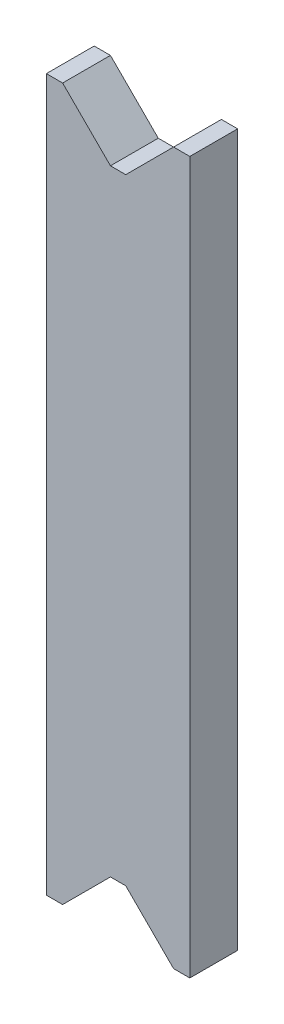
ISO-10303-21;
HEADER;
FILE_DESCRIPTION(('STEP AP214'),'2;1');
FILE_NAME('part.step','',(''),(''),'','','');
FILE_SCHEMA(('AUTOMOTIVE_DESIGN { 1 0 10303 214 1 1 1 1 }'));
ENDSEC;
DATA;
#1=APPLICATION_CONTEXT('core data for automotive mechanical design processes');
#2=APPLICATION_PROTOCOL_DEFINITION('international standard','automotive_design',2000,#1);
#3=PRODUCT_CONTEXT('',#1,'mechanical');
#4=PRODUCT('Part','Part','',(#3));
#5=PRODUCT_RELATED_PRODUCT_CATEGORY('part','',(#4));
#6=PRODUCT_DEFINITION_FORMATION('','',#4);
#7=PRODUCT_DEFINITION_CONTEXT('part definition',#1,'design');
#8=PRODUCT_DEFINITION('design','',#6,#7);
#9=PRODUCT_DEFINITION_SHAPE('','',#8);
#10=(LENGTH_UNIT() NAMED_UNIT(*) SI_UNIT(.MILLI.,.METRE.));
#11=(NAMED_UNIT(*) PLANE_ANGLE_UNIT() SI_UNIT($,.RADIAN.));
#12=(NAMED_UNIT(*) SI_UNIT($,.STERADIAN.) SOLID_ANGLE_UNIT());
#13=UNCERTAINTY_MEASURE_WITH_UNIT(LENGTH_MEASURE(1.E-05),#10,'distance_accuracy_value','');
#14=(GEOMETRIC_REPRESENTATION_CONTEXT(3) GLOBAL_UNCERTAINTY_ASSIGNED_CONTEXT((#13)) GLOBAL_UNIT_ASSIGNED_CONTEXT((#10,
#11,#12)) REPRESENTATION_CONTEXT('',''));
#15=CARTESIAN_POINT('',(0.,0.,0.));
#16=DIRECTION('',(0.,0.,1.));
#17=DIRECTION('',(1.,0.,0.));
#18=AXIS2_PLACEMENT_3D('',#15,#16,#17);
#19=CARTESIAN_POINT('',(-105.726517228664,-444.227073158468,-1458.14397018632));
#20=DIRECTION('',(0.,-1.,0.));
#21=DIRECTION('',(1.,0.,0.));
#22=AXIS2_PLACEMENT_3D('',#19,#20,#21);
#23=PLANE('',#22);
#24=DIRECTION('',(0.,0.,1.));
#25=VECTOR('',#24,1.);
#26=CARTESIAN_POINT('',(-104.647017228664,-444.227073158468,-1458.14397018632));
#27=LINE('',#26,#25);
#28=CARTESIAN_POINT('',(-104.647017228664,-444.227073158468,-1454.96897018632));
#29=VERTEX_POINT('',#28);
#30=CARTESIAN_POINT('',(-104.647017228664,-444.227073158468,-1458.14397018632));
#31=VERTEX_POINT('',#30);
#32=EDGE_CURVE('E154',#29,#31,#27,.F.);
#33=ORIENTED_EDGE('',*,*,#32,.F.);
#34=DIRECTION('',(1.,0.,0.));
#35=VECTOR('',#34,1.);
#36=CARTESIAN_POINT('',(-105.726517228664,-444.227073158468,-1454.96897018632));
#37=LINE('',#36,#35);
#38=CARTESIAN_POINT('',(-105.726517228664,-444.227073158468,-1454.96897018632));
#39=VERTEX_POINT('',#38);
#40=EDGE_CURVE('E20',#29,#39,#37,.F.);
#41=ORIENTED_EDGE('',*,*,#40,.T.);
#42=DIRECTION('',(0.,0.,1.));
#43=VECTOR('',#42,1.);
#44=CARTESIAN_POINT('',(-105.726517228664,-444.227073158468,-1458.14397018632));
#45=LINE('',#44,#43);
#46=CARTESIAN_POINT('',(-105.726517228664,-444.227073158468,-1458.14397018632));
#47=VERTEX_POINT('',#46);
#48=EDGE_CURVE('E125',#47,#39,#45,.T.);
#49=ORIENTED_EDGE('',*,*,#48,.F.);
#50=DIRECTION('',(1.,0.,0.));
#51=VECTOR('',#50,1.);
#52=CARTESIAN_POINT('',(-109.409517228664,-444.227073158468,-1458.14397018632));
#53=LINE('',#52,#51);
#54=EDGE_CURVE('E102',#47,#31,#53,.T.);
#55=ORIENTED_EDGE('',*,*,#54,.T.);
#56=EDGE_LOOP('',(#33,#41,#49,#55));
#57=FACE_BOUND('',#56,.T.);
#58=ADVANCED_FACE('F17',(#57),#23,.T.);
#59=CARTESIAN_POINT('',(-104.647017228664,-396.983073158468,-1458.14397018632));
#60=DIRECTION('',(0.,1.,0.));
#61=DIRECTION('',(-1.,0.,0.));
#62=AXIS2_PLACEMENT_3D('',#59,#60,#61);
#63=PLANE('',#62);
#64=DIRECTION('',(0.,0.,1.));
#65=VECTOR('',#64,1.);
#66=CARTESIAN_POINT('',(-105.726517228664,-396.983073158468,-1458.14397018632));
#67=LINE('',#66,#65);
#68=CARTESIAN_POINT('',(-105.726517228664,-396.983073158468,-1454.96897018632));
#69=VERTEX_POINT('',#68);
#70=CARTESIAN_POINT('',(-105.726517228664,-396.983073158468,-1458.14397018632));
#71=VERTEX_POINT('',#70);
#72=EDGE_CURVE('E194',#69,#71,#67,.F.);
#73=ORIENTED_EDGE('',*,*,#72,.F.);
#74=DIRECTION('',(-1.,0.,0.));
#75=VECTOR('',#74,1.);
#76=CARTESIAN_POINT('',(-104.647017228664,-396.983073158468,-1454.96897018632));
#77=LINE('',#76,#75);
#78=CARTESIAN_POINT('',(-104.647017228664,-396.983073158468,-1454.96897018632));
#79=VERTEX_POINT('',#78);
#80=EDGE_CURVE('E146',#69,#79,#77,.F.);
#81=ORIENTED_EDGE('',*,*,#80,.T.);
#82=DIRECTION('',(0.,0.,1.));
#83=VECTOR('',#82,1.);
#84=CARTESIAN_POINT('',(-104.647017228664,-396.983073158468,-1458.14397018632));
#85=LINE('',#84,#83);
#86=CARTESIAN_POINT('',(-104.647017228664,-396.983073158468,-1458.14397018632));
#87=VERTEX_POINT('',#86);
#88=EDGE_CURVE('E197',#87,#79,#85,.T.);
#89=ORIENTED_EDGE('',*,*,#88,.F.);
#90=DIRECTION('',(1.,0.,0.));
#91=VECTOR('',#90,1.);
#92=CARTESIAN_POINT('',(-109.409517228664,-396.983073158468,-1458.14397018632));
#93=LINE('',#92,#91);
#94=EDGE_CURVE('E139',#87,#71,#93,.F.);
#95=ORIENTED_EDGE('',*,*,#94,.T.);
#96=EDGE_LOOP('',(#73,#81,#89,#95));
#97=FACE_BOUND('',#96,.T.);
#98=ADVANCED_FACE('F206',(#97),#63,.T.);
#99=CARTESIAN_POINT('',(-108.901517228664,-400.158073158468,-1458.14397018632));
#100=DIRECTION('',(0.,1.,0.));
#101=DIRECTION('',(-1.,0.,0.));
#102=AXIS2_PLACEMENT_3D('',#99,#100,#101);
#103=PLANE('',#102);
#104=DIRECTION('',(0.,0.,1.));
#105=VECTOR('',#104,1.);
#106=CARTESIAN_POINT('',(-109.917517228664,-400.158073158468,-1458.14397018632));
#107=LINE('',#106,#105);
#108=CARTESIAN_POINT('',(-109.917517228664,-400.158073158468,-1454.96897018632));
#109=VERTEX_POINT('',#108);
#110=CARTESIAN_POINT('',(-109.917517228664,-400.158073158468,-1458.14397018632));
#111=VERTEX_POINT('',#110);
#112=EDGE_CURVE('E185',#109,#111,#107,.F.);
#113=ORIENTED_EDGE('',*,*,#112,.F.);
#114=DIRECTION('',(-1.,0.,0.));
#115=VECTOR('',#114,1.);
#116=CARTESIAN_POINT('',(-108.901517228664,-400.158073158468,-1454.96897018632));
#117=LINE('',#116,#115);
#118=CARTESIAN_POINT('',(-108.901517228664,-400.158073158468,-1454.96897018632));
#119=VERTEX_POINT('',#118);
#120=EDGE_CURVE('E145',#109,#119,#117,.F.);
#121=ORIENTED_EDGE('',*,*,#120,.T.);
#122=DIRECTION('',(0.,0.,1.));
#123=VECTOR('',#122,1.);
#124=CARTESIAN_POINT('',(-108.901517228664,-400.158073158468,-1458.14397018632));
#125=LINE('',#124,#123);
#126=CARTESIAN_POINT('',(-108.901517228664,-400.158073158468,-1458.14397018632));
#127=VERTEX_POINT('',#126);
#128=EDGE_CURVE('E188',#127,#119,#125,.T.);
#129=ORIENTED_EDGE('',*,*,#128,.F.);
#130=DIRECTION('',(1.,0.,0.));
#131=VECTOR('',#130,1.);
#132=CARTESIAN_POINT('',(-109.409517228664,-400.158073158468,-1458.14397018632));
#133=LINE('',#132,#131);
#134=EDGE_CURVE('E137',#127,#111,#133,.F.);
#135=ORIENTED_EDGE('',*,*,#134,.T.);
#136=EDGE_LOOP('',(#113,#121,#129,#135));
#137=FACE_BOUND('',#136,.T.);
#138=ADVANCED_FACE('F235',(#137),#103,.T.);
#139=CARTESIAN_POINT('',(-113.092517228664,-396.983073158468,-1458.14397018632));
#140=DIRECTION('',(0.,1.,0.));
#141=DIRECTION('',(-1.,0.,0.));
#142=AXIS2_PLACEMENT_3D('',#139,#140,#141);
#143=PLANE('',#142);
#144=DIRECTION('',(0.,0.,1.));
#145=VECTOR('',#144,1.);
#146=CARTESIAN_POINT('',(-114.172017228664,-396.983073158468,-1458.14397018632));
#147=LINE('',#146,#145);
#148=CARTESIAN_POINT('',(-114.172017228664,-396.983073158468,-1454.96897018632));
#149=VERTEX_POINT('',#148);
#150=CARTESIAN_POINT('',(-114.172017228664,-396.983073158468,-1458.14397018632));
#151=VERTEX_POINT('',#150);
#152=EDGE_CURVE('E176',#149,#151,#147,.F.);
#153=ORIENTED_EDGE('',*,*,#152,.F.);
#154=DIRECTION('',(-1.,0.,0.));
#155=VECTOR('',#154,1.);
#156=CARTESIAN_POINT('',(-113.092517228664,-396.983073158468,-1454.96897018632));
#157=LINE('',#156,#155);
#158=CARTESIAN_POINT('',(-113.092517228664,-396.983073158468,-1454.96897018632));
#159=VERTEX_POINT('',#158);
#160=EDGE_CURVE('E143',#149,#159,#157,.F.);
#161=ORIENTED_EDGE('',*,*,#160,.T.);
#162=DIRECTION('',(0.,0.,1.));
#163=VECTOR('',#162,1.);
#164=CARTESIAN_POINT('',(-113.092517228664,-396.983073158468,-1458.14397018632));
#165=LINE('',#164,#163);
#166=CARTESIAN_POINT('',(-113.092517228664,-396.983073158468,-1458.14397018632));
#167=VERTEX_POINT('',#166);
#168=EDGE_CURVE('E179',#167,#159,#165,.T.);
#169=ORIENTED_EDGE('',*,*,#168,.F.);
#170=DIRECTION('',(1.,0.,0.));
#171=VECTOR('',#170,1.);
#172=CARTESIAN_POINT('',(-109.409517228664,-396.983073158468,-1458.14397018632));
#173=LINE('',#172,#171);
#174=EDGE_CURVE('E135',#167,#151,#173,.F.);
#175=ORIENTED_EDGE('',*,*,#174,.T.);
#176=EDGE_LOOP('',(#153,#161,#169,#175));
#177=FACE_BOUND('',#176,.T.);
#178=ADVANCED_FACE('F229',(#177),#143,.T.);
#179=CARTESIAN_POINT('',(-114.172017228664,-444.227073158468,-1458.14397018632));
#180=DIRECTION('',(0.,-1.,0.));
#181=DIRECTION('',(1.,0.,0.));
#182=AXIS2_PLACEMENT_3D('',#179,#180,#181);
#183=PLANE('',#182);
#184=DIRECTION('',(0.,0.,1.));
#185=VECTOR('',#184,1.);
#186=CARTESIAN_POINT('',(-113.092517228664,-444.227073158468,-1458.14397018632));
#187=LINE('',#186,#185);
#188=CARTESIAN_POINT('',(-113.092517228664,-444.227073158468,-1454.96897018632));
#189=VERTEX_POINT('',#188);
#190=CARTESIAN_POINT('',(-113.092517228664,-444.227073158468,-1458.14397018632));
#191=VERTEX_POINT('',#190);
#192=EDGE_CURVE('E167',#189,#191,#187,.F.);
#193=ORIENTED_EDGE('',*,*,#192,.F.);
#194=DIRECTION('',(1.,0.,0.));
#195=VECTOR('',#194,1.);
#196=CARTESIAN_POINT('',(-114.172017228664,-444.227073158468,-1454.96897018632));
#197=LINE('',#196,#195);
#198=CARTESIAN_POINT('',(-114.172017228664,-444.227073158468,-1454.96897018632));
#199=VERTEX_POINT('',#198);
#200=EDGE_CURVE('E34',#189,#199,#197,.F.);
#201=ORIENTED_EDGE('',*,*,#200,.T.);
#202=DIRECTION('',(0.,0.,1.));
#203=VECTOR('',#202,1.);
#204=CARTESIAN_POINT('',(-114.172017228664,-444.227073158468,-1458.14397018632));
#205=LINE('',#204,#203);
#206=CARTESIAN_POINT('',(-114.172017228664,-444.227073158468,-1458.14397018632));
#207=VERTEX_POINT('',#206);
#208=EDGE_CURVE('E170',#207,#199,#205,.T.);
#209=ORIENTED_EDGE('',*,*,#208,.F.);
#210=DIRECTION('',(1.,0.,0.));
#211=VECTOR('',#210,1.);
#212=CARTESIAN_POINT('',(-109.409517228664,-444.227073158468,-1458.14397018632));
#213=LINE('',#212,#211);
#214=EDGE_CURVE('E118',#207,#191,#213,.T.);
#215=ORIENTED_EDGE('',*,*,#214,.T.);
#216=EDGE_LOOP('',(#193,#201,#209,#215));
#217=FACE_BOUND('',#216,.T.);
#218=ADVANCED_FACE('F222',(#217),#183,.T.);
#219=CARTESIAN_POINT('',(-109.409517228664,-420.605073158468,-1458.14397018632));
#220=DIRECTION('',(0.,0.,1.));
#221=DIRECTION('',(1.,0.,0.));
#222=AXIS2_PLACEMENT_3D('',#219,#220,#221);
#223=PLANE('',#222);
#224=ORIENTED_EDGE('',*,*,#214,.F.);
#225=DIRECTION('',(0.,-1.,0.));
#226=VECTOR('',#225,1.);
#227=CARTESIAN_POINT('',(-114.172017228664,-396.983073158468,-1458.14397018632));
#228=LINE('',#227,#226);
#229=EDGE_CURVE('E173',#151,#207,#228,.T.);
#230=ORIENTED_EDGE('',*,*,#229,.F.);
#231=ORIENTED_EDGE('',*,*,#174,.F.);
#232=DIRECTION('',(-0.707106781186548,0.707106781186548,0.));
#233=VECTOR('',#232,1.);
#234=CARTESIAN_POINT('',(-109.917517228664,-400.158073158468,-1458.14397018632));
#235=LINE('',#234,#233);
#236=EDGE_CURVE('E182',#111,#167,#235,.T.);
#237=ORIENTED_EDGE('',*,*,#236,.F.);
#238=ORIENTED_EDGE('',*,*,#134,.F.);
#239=DIRECTION('',(-0.707106781186548,-0.707106781186548,0.));
#240=VECTOR('',#239,1.);
#241=CARTESIAN_POINT('',(-105.726517228664,-396.983073158468,-1458.14397018632));
#242=LINE('',#241,#240);
#243=EDGE_CURVE('E191',#71,#127,#242,.T.);
#244=ORIENTED_EDGE('',*,*,#243,.F.);
#245=ORIENTED_EDGE('',*,*,#94,.F.);
#246=DIRECTION('',(0.,1.,0.));
#247=VECTOR('',#246,1.);
#248=CARTESIAN_POINT('',(-104.647017228664,-444.227073158468,-1458.14397018632));
#249=LINE('',#248,#247);
#250=EDGE_CURVE('E199',#31,#87,#249,.T.);
#251=ORIENTED_EDGE('',*,*,#250,.F.);
#252=ORIENTED_EDGE('',*,*,#54,.F.);
#253=DIRECTION('',(0.707106781186548,-0.707106781186548,0.));
#254=VECTOR('',#253,1.);
#255=CARTESIAN_POINT('',(-108.901517228664,-441.052073158468,-1458.14397018632));
#256=LINE('',#255,#254);
#257=CARTESIAN_POINT('',(-108.901517228664,-441.052073158468,-1458.14397018632));
#258=VERTEX_POINT('',#257);
#259=EDGE_CURVE('E121',#258,#47,#256,.T.);
#260=ORIENTED_EDGE('',*,*,#259,.F.);
#261=DIRECTION('',(1.,0.,0.));
#262=VECTOR('',#261,1.);
#263=CARTESIAN_POINT('',(-109.917517228664,-441.052073158468,-1458.14397018632));
#264=LINE('',#263,#262);
#265=CARTESIAN_POINT('',(-109.917517228664,-441.052073158468,-1458.14397018632));
#266=VERTEX_POINT('',#265);
#267=EDGE_CURVE('E108',#266,#258,#264,.T.);
#268=ORIENTED_EDGE('',*,*,#267,.F.);
#269=DIRECTION('',(0.707106781186548,0.707106781186548,0.));
#270=VECTOR('',#269,1.);
#271=CARTESIAN_POINT('',(-113.092517228664,-444.227073158468,-1458.14397018632));
#272=LINE('',#271,#270);
#273=EDGE_CURVE('E162',#191,#266,#272,.T.);
#274=ORIENTED_EDGE('',*,*,#273,.F.);
#275=EDGE_LOOP('',(#224,#230,#231,#237,#238,#244,#245,#251,#252,#260,#268,#274));
#276=FACE_BOUND('',#275,.T.);
#277=ADVANCED_FACE('F122',(#276),#223,.F.);
#278=CARTESIAN_POINT('',(-109.917517228664,-441.052073158468,-1458.14397018632));
#279=DIRECTION('',(0.,-1.,0.));
#280=DIRECTION('',(1.,0.,0.));
#281=AXIS2_PLACEMENT_3D('',#278,#279,#280);
#282=PLANE('',#281);
#283=DIRECTION('',(0.,0.,1.));
#284=VECTOR('',#283,1.);
#285=CARTESIAN_POINT('',(-108.901517228664,-441.052073158468,-1458.14397018632));
#286=LINE('',#285,#284);
#287=CARTESIAN_POINT('',(-108.901517228664,-441.052073158468,-1454.96897018632));
#288=VERTEX_POINT('',#287);
#289=EDGE_CURVE('E111',#288,#258,#286,.F.);
#290=ORIENTED_EDGE('',*,*,#289,.F.);
#291=DIRECTION('',(1.,0.,0.));
#292=VECTOR('',#291,1.);
#293=CARTESIAN_POINT('',(-109.917517228664,-441.052073158468,-1454.96897018632));
#294=LINE('',#293,#292);
#295=CARTESIAN_POINT('',(-109.917517228664,-441.052073158468,-1454.96897018632));
#296=VERTEX_POINT('',#295);
#297=EDGE_CURVE('E117',#288,#296,#294,.F.);
#298=ORIENTED_EDGE('',*,*,#297,.T.);
#299=DIRECTION('',(0.,0.,1.));
#300=VECTOR('',#299,1.);
#301=CARTESIAN_POINT('',(-109.917517228664,-441.052073158468,-1458.14397018632));
#302=LINE('',#301,#300);
#303=EDGE_CURVE('E114',#266,#296,#302,.T.);
#304=ORIENTED_EDGE('',*,*,#303,.F.);
#305=ORIENTED_EDGE('',*,*,#267,.T.);
#306=EDGE_LOOP('',(#290,#298,#304,#305));
#307=FACE_BOUND('',#306,.T.);
#308=ADVANCED_FACE('F109',(#307),#282,.T.);
#309=CARTESIAN_POINT('',(-108.901517228664,-441.052073158468,-1458.14397018632));
#310=DIRECTION('',(-0.707106781186548,-0.707106781186548,0.));
#311=DIRECTION('',(0.707106781186548,-0.707106781186548,0.));
#312=AXIS2_PLACEMENT_3D('',#309,#310,#311);
#313=PLANE('',#312);
#314=ORIENTED_EDGE('',*,*,#48,.T.);
#315=DIRECTION('',(0.707106781186551,-0.707106781186544,0.));
#316=VECTOR('',#315,1.);
#317=CARTESIAN_POINT('',(-108.901517228664,-441.052073158468,-1454.96897018632));
#318=LINE('',#317,#316);
#319=EDGE_CURVE('E129',#288,#39,#318,.T.);
#320=ORIENTED_EDGE('',*,*,#319,.F.);
#321=ORIENTED_EDGE('',*,*,#289,.T.);
#322=ORIENTED_EDGE('',*,*,#259,.T.);
#323=EDGE_LOOP('',(#314,#320,#321,#322));
#324=FACE_BOUND('',#323,.T.);
#325=ADVANCED_FACE('F127',(#324),#313,.T.);
#326=CARTESIAN_POINT('',(-104.647017228664,-444.227073158468,-1458.14397018632));
#327=DIRECTION('',(1.,0.,0.));
#328=DIRECTION('',(0.,1.,0.));
#329=AXIS2_PLACEMENT_3D('',#326,#327,#328);
#330=PLANE('',#329);
#331=ORIENTED_EDGE('',*,*,#88,.T.);
#332=DIRECTION('',(0.,1.,0.));
#333=VECTOR('',#332,1.);
#334=CARTESIAN_POINT('',(-104.647017228664,-420.605073158468,-1454.96897018632));
#335=LINE('',#334,#333);
#336=EDGE_CURVE('E158',#29,#79,#335,.T.);
#337=ORIENTED_EDGE('',*,*,#336,.F.);
#338=ORIENTED_EDGE('',*,*,#32,.T.);
#339=ORIENTED_EDGE('',*,*,#250,.T.);
#340=EDGE_LOOP('',(#331,#337,#338,#339));
#341=FACE_BOUND('',#340,.T.);
#342=ADVANCED_FACE('F203',(#341),#330,.T.);
#343=CARTESIAN_POINT('',(-105.726517228664,-396.983073158468,-1458.14397018632));
#344=DIRECTION('',(-0.707106781186548,0.707106781186548,0.));
#345=DIRECTION('',(-0.707106781186548,-0.707106781186548,0.));
#346=AXIS2_PLACEMENT_3D('',#343,#344,#345);
#347=PLANE('',#346);
#348=ORIENTED_EDGE('',*,*,#128,.T.);
#349=DIRECTION('',(-0.707106781186551,-0.707106781186544,0.));
#350=VECTOR('',#349,1.);
#351=CARTESIAN_POINT('',(-105.726517228664,-396.983073158468,-1454.96897018632));
#352=LINE('',#351,#350);
#353=EDGE_CURVE('E160',#69,#119,#352,.T.);
#354=ORIENTED_EDGE('',*,*,#353,.F.);
#355=ORIENTED_EDGE('',*,*,#72,.T.);
#356=ORIENTED_EDGE('',*,*,#243,.T.);
#357=EDGE_LOOP('',(#348,#354,#355,#356));
#358=FACE_BOUND('',#357,.T.);
#359=ADVANCED_FACE('F209',(#358),#347,.T.);
#360=CARTESIAN_POINT('',(-109.917517228664,-400.158073158468,-1458.14397018632));
#361=DIRECTION('',(0.707106781186548,0.707106781186548,0.));
#362=DIRECTION('',(-0.707106781186548,0.707106781186548,0.));
#363=AXIS2_PLACEMENT_3D('',#360,#361,#362);
#364=PLANE('',#363);
#365=ORIENTED_EDGE('',*,*,#168,.T.);
#366=DIRECTION('',(-0.707106781186549,0.707106781186546,0.));
#367=VECTOR('',#366,1.);
#368=CARTESIAN_POINT('',(-109.917517228664,-400.158073158468,-1454.96897018632));
#369=LINE('',#368,#367);
#370=EDGE_CURVE('E211',#109,#159,#369,.T.);
#371=ORIENTED_EDGE('',*,*,#370,.F.);
#372=ORIENTED_EDGE('',*,*,#112,.T.);
#373=ORIENTED_EDGE('',*,*,#236,.T.);
#374=EDGE_LOOP('',(#365,#371,#372,#373));
#375=FACE_BOUND('',#374,.T.);
#376=ADVANCED_FACE('F232',(#375),#364,.T.);
#377=CARTESIAN_POINT('',(-114.172017228664,-396.983073158468,-1458.14397018632));
#378=DIRECTION('',(-1.,0.,0.));
#379=DIRECTION('',(0.,-1.,0.));
#380=AXIS2_PLACEMENT_3D('',#377,#378,#379);
#381=PLANE('',#380);
#382=ORIENTED_EDGE('',*,*,#208,.T.);
#383=DIRECTION('',(0.,1.,0.));
#384=VECTOR('',#383,1.);
#385=CARTESIAN_POINT('',(-114.172017228664,-420.605073158468,-1454.96897018632));
#386=LINE('',#385,#384);
#387=EDGE_CURVE('E26',#149,#199,#386,.F.);
#388=ORIENTED_EDGE('',*,*,#387,.F.);
#389=ORIENTED_EDGE('',*,*,#152,.T.);
#390=ORIENTED_EDGE('',*,*,#229,.T.);
#391=EDGE_LOOP('',(#382,#388,#389,#390));
#392=FACE_BOUND('',#391,.T.);
#393=ADVANCED_FACE('F218',(#392),#381,.T.);
#394=CARTESIAN_POINT('',(-113.092517228664,-444.227073158468,-1458.14397018632));
#395=DIRECTION('',(0.707106781186548,-0.707106781186548,0.));
#396=DIRECTION('',(0.707106781186548,0.707106781186548,0.));
#397=AXIS2_PLACEMENT_3D('',#394,#395,#396);
#398=PLANE('',#397);
#399=ORIENTED_EDGE('',*,*,#303,.T.);
#400=DIRECTION('',(0.707106781186549,0.707106781186546,0.));
#401=VECTOR('',#400,1.);
#402=CARTESIAN_POINT('',(-113.092517228664,-444.227073158468,-1454.96897018632));
#403=LINE('',#402,#401);
#404=EDGE_CURVE('E11',#189,#296,#403,.T.);
#405=ORIENTED_EDGE('',*,*,#404,.F.);
#406=ORIENTED_EDGE('',*,*,#192,.T.);
#407=ORIENTED_EDGE('',*,*,#273,.T.);
#408=EDGE_LOOP('',(#399,#405,#406,#407));
#409=FACE_BOUND('',#408,.T.);
#410=ADVANCED_FACE('F225',(#409),#398,.T.);
#411=CARTESIAN_POINT('',(-109.409517228664,-420.605073158468,-1454.96897018632));
#412=DIRECTION('',(0.,0.,1.));
#413=DIRECTION('',(1.,0.,0.));
#414=AXIS2_PLACEMENT_3D('',#411,#412,#413);
#415=PLANE('',#414);
#416=ORIENTED_EDGE('',*,*,#200,.F.);
#417=ORIENTED_EDGE('',*,*,#404,.T.);
#418=ORIENTED_EDGE('',*,*,#297,.F.);
#419=ORIENTED_EDGE('',*,*,#319,.T.);
#420=ORIENTED_EDGE('',*,*,#40,.F.);
#421=ORIENTED_EDGE('',*,*,#336,.T.);
#422=ORIENTED_EDGE('',*,*,#80,.F.);
#423=ORIENTED_EDGE('',*,*,#353,.T.);
#424=ORIENTED_EDGE('',*,*,#120,.F.);
#425=ORIENTED_EDGE('',*,*,#370,.T.);
#426=ORIENTED_EDGE('',*,*,#160,.F.);
#427=ORIENTED_EDGE('',*,*,#387,.T.);
#428=EDGE_LOOP('',(#416,#417,#418,#419,#420,#421,#422,#423,#424,#425,#426,#427));
#429=FACE_BOUND('',#428,.T.);
#430=ADVANCED_FACE('F157',(#429),#415,.T.);
#431=CLOSED_SHELL('',(#58,#98,#138,#178,#218,#277,#308,#325,#342,#359,#376,#393,#410,#430));
#432=MANIFOLD_SOLID_BREP('B1',#431);
#433=ADVANCED_BREP_SHAPE_REPRESENTATION('',(#18,#432),#14);
#434=SHAPE_DEFINITION_REPRESENTATION(#9,#433);
ENDSEC;
END-ISO-10303-21;
